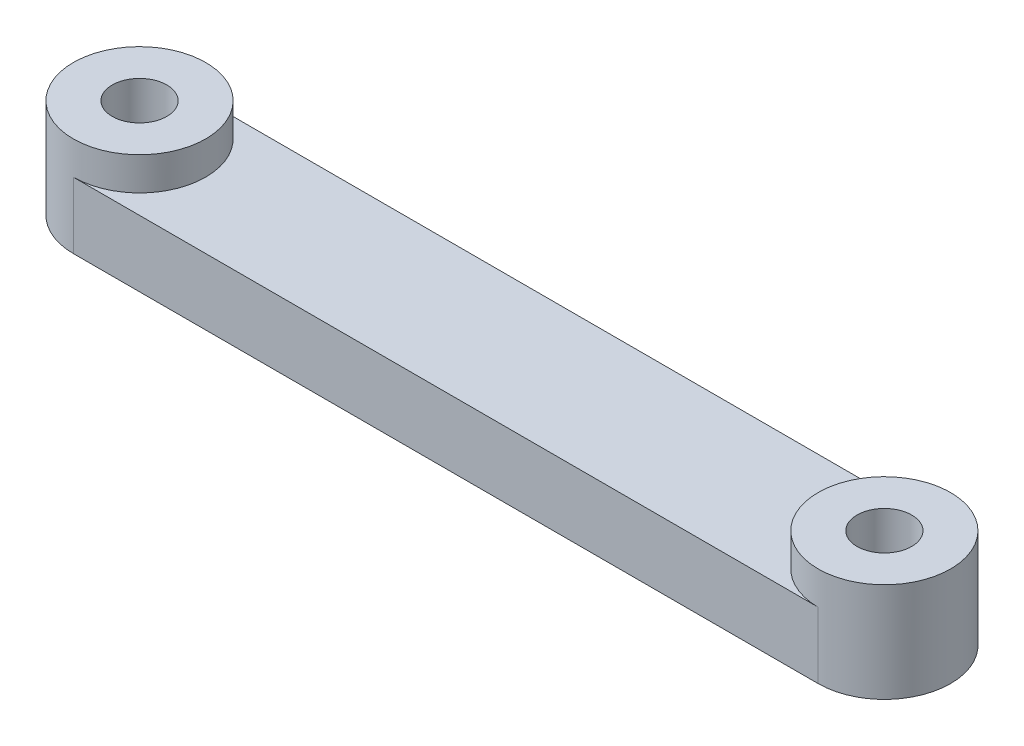
ISO-10303-21;
HEADER;
FILE_DESCRIPTION(('STEP AP214'),'2;1');
FILE_NAME('part.step','',(''),(''),'','','');
FILE_SCHEMA(('AUTOMOTIVE_DESIGN { 1 0 10303 214 1 1 1 1 }'));
ENDSEC;
DATA;
#1=APPLICATION_CONTEXT('core data for automotive mechanical design processes');
#2=APPLICATION_PROTOCOL_DEFINITION('international standard','automotive_design',2000,#1);
#3=PRODUCT_CONTEXT('',#1,'mechanical');
#4=PRODUCT('Part','Part','',(#3));
#5=PRODUCT_RELATED_PRODUCT_CATEGORY('part','',(#4));
#6=PRODUCT_DEFINITION_FORMATION('','',#4);
#7=PRODUCT_DEFINITION_CONTEXT('part definition',#1,'design');
#8=PRODUCT_DEFINITION('design','',#6,#7);
#9=PRODUCT_DEFINITION_SHAPE('','',#8);
#10=(LENGTH_UNIT() NAMED_UNIT(*) SI_UNIT(.MILLI.,.METRE.));
#11=(NAMED_UNIT(*) PLANE_ANGLE_UNIT() SI_UNIT($,.RADIAN.));
#12=(NAMED_UNIT(*) SI_UNIT($,.STERADIAN.) SOLID_ANGLE_UNIT());
#13=UNCERTAINTY_MEASURE_WITH_UNIT(LENGTH_MEASURE(1.E-05),#10,'distance_accuracy_value','');
#14=(GEOMETRIC_REPRESENTATION_CONTEXT(3) GLOBAL_UNCERTAINTY_ASSIGNED_CONTEXT((#13)) GLOBAL_UNIT_ASSIGNED_CONTEXT((#10,
#11,#12)) REPRESENTATION_CONTEXT('',''));
#15=CARTESIAN_POINT('',(0.,0.,0.));
#16=DIRECTION('',(0.,0.,1.));
#17=DIRECTION('',(1.,0.,0.));
#18=AXIS2_PLACEMENT_3D('',#15,#16,#17);
#19=CARTESIAN_POINT('',(-22.5,4.,0.));
#20=DIRECTION('',(0.,1.,0.));
#21=DIRECTION('',(0.,0.,1.));
#22=AXIS2_PLACEMENT_3D('',#19,#20,#21);
#23=PLANE('',#22);
#24=DIRECTION('',(1.,0.,0.));
#25=VECTOR('',#24,1.);
#26=CARTESIAN_POINT('',(-22.5,4.,4.));
#27=LINE('',#26,#25);
#28=CARTESIAN_POINT('',(-22.5,4.,4.));
#29=VERTEX_POINT('',#28);
#30=CARTESIAN_POINT('',(22.5,4.,4.));
#31=VERTEX_POINT('',#30);
#32=EDGE_CURVE('E95',#29,#31,#27,.T.);
#33=ORIENTED_EDGE('',*,*,#32,.T.);
#34=CARTESIAN_POINT('',(22.5,4.,0.));
#35=DIRECTION('',(0.,1.,0.));
#36=DIRECTION('',(0.,0.,1.));
#37=AXIS2_PLACEMENT_3D('',#34,#35,#36);
#38=CIRCLE('',#37,4.);
#39=CARTESIAN_POINT('',(22.5,4.,-4.));
#40=VERTEX_POINT('',#39);
#41=EDGE_CURVE('E128',#40,#31,#38,.T.);
#42=ORIENTED_EDGE('',*,*,#41,.F.);
#43=DIRECTION('',(-1.,0.,0.));
#44=VECTOR('',#43,1.);
#45=CARTESIAN_POINT('',(-22.5,4.,-4.));
#46=LINE('',#45,#44);
#47=CARTESIAN_POINT('',(-22.5,4.,-4.));
#48=VERTEX_POINT('',#47);
#49=EDGE_CURVE('E63',#40,#48,#46,.T.);
#50=ORIENTED_EDGE('',*,*,#49,.T.);
#51=CARTESIAN_POINT('',(-22.5,4.,0.));
#52=DIRECTION('',(0.,1.,0.));
#53=DIRECTION('',(0.,0.,1.));
#54=AXIS2_PLACEMENT_3D('',#51,#52,#53);
#55=CIRCLE('',#54,4.);
#56=EDGE_CURVE('E102',#29,#48,#55,.T.);
#57=ORIENTED_EDGE('',*,*,#56,.F.);
#58=EDGE_LOOP('',(#33,#42,#50,#57));
#59=FACE_BOUND('',#58,.T.);
#60=ADVANCED_FACE('F45',(#59),#23,.T.);
#61=CARTESIAN_POINT('',(-22.5,0.,0.));
#62=DIRECTION('',(0.,1.,0.));
#63=DIRECTION('',(0.,0.,1.));
#64=AXIS2_PLACEMENT_3D('',#61,#62,#63);
#65=PLANE('',#64);
#66=CARTESIAN_POINT('',(-22.5,0.,0.));
#67=DIRECTION('',(0.,1.,0.));
#68=DIRECTION('',(0.,0.,1.));
#69=AXIS2_PLACEMENT_3D('',#66,#67,#68);
#70=CIRCLE('',#69,4.);
#71=CARTESIAN_POINT('',(-22.5,0.,-4.));
#72=VERTEX_POINT('',#71);
#73=CARTESIAN_POINT('',(-22.5,0.,4.));
#74=VERTEX_POINT('',#73);
#75=EDGE_CURVE('E101',#72,#74,#70,.T.);
#76=ORIENTED_EDGE('',*,*,#75,.F.);
#77=DIRECTION('',(-1.,0.,0.));
#78=VECTOR('',#77,1.);
#79=CARTESIAN_POINT('',(-22.5,0.,-4.));
#80=LINE('',#79,#78);
#81=CARTESIAN_POINT('',(22.5,0.,-4.));
#82=VERTEX_POINT('',#81);
#83=EDGE_CURVE('E86',#82,#72,#80,.T.);
#84=ORIENTED_EDGE('',*,*,#83,.F.);
#85=CARTESIAN_POINT('',(22.5,0.,0.));
#86=DIRECTION('',(0.,1.,0.));
#87=DIRECTION('',(0.,0.,1.));
#88=AXIS2_PLACEMENT_3D('',#85,#86,#87);
#89=CIRCLE('',#88,4.);
#90=CARTESIAN_POINT('',(22.5,0.,4.));
#91=VERTEX_POINT('',#90);
#92=EDGE_CURVE('E81',#91,#82,#89,.T.);
#93=ORIENTED_EDGE('',*,*,#92,.F.);
#94=DIRECTION('',(1.,0.,0.));
#95=VECTOR('',#94,1.);
#96=CARTESIAN_POINT('',(-22.5,0.,4.));
#97=LINE('',#96,#95);
#98=EDGE_CURVE('E107',#74,#91,#97,.T.);
#99=ORIENTED_EDGE('',*,*,#98,.F.);
#100=EDGE_LOOP('',(#76,#84,#93,#99));
#101=FACE_BOUND('',#100,.T.);
#102=CARTESIAN_POINT('',(-22.5,0.,0.));
#103=DIRECTION('',(0.,1.,0.));
#104=DIRECTION('',(0.,0.,1.));
#105=AXIS2_PLACEMENT_3D('',#102,#103,#104);
#106=CIRCLE('',#105,1.65);
#107=CARTESIAN_POINT('',(-22.5,0.,1.65));
#108=VERTEX_POINT('',#107);
#109=EDGE_CURVE('E109',#108,#108,#106,.T.);
#110=ORIENTED_EDGE('',*,*,#109,.T.);
#111=EDGE_LOOP('',(#110));
#112=FACE_BOUND('',#111,.T.);
#113=CARTESIAN_POINT('',(22.5,0.,0.));
#114=DIRECTION('',(0.,1.,0.));
#115=DIRECTION('',(0.,0.,1.));
#116=AXIS2_PLACEMENT_3D('',#113,#114,#115);
#117=CIRCLE('',#116,1.65);
#118=CARTESIAN_POINT('',(22.5,0.,1.65));
#119=VERTEX_POINT('',#118);
#120=EDGE_CURVE('E115',#119,#119,#117,.T.);
#121=ORIENTED_EDGE('',*,*,#120,.T.);
#122=EDGE_LOOP('',(#121));
#123=FACE_BOUND('',#122,.T.);
#124=ADVANCED_FACE('F105',(#101,#112,#123),#65,.F.);
#125=CARTESIAN_POINT('',(-22.5,4.,0.));
#126=DIRECTION('',(0.,-1.,0.));
#127=DIRECTION('',(0.,0.,-1.));
#128=AXIS2_PLACEMENT_3D('',#125,#126,#127);
#129=CYLINDRICAL_SURFACE('',#128,4.);
#130=ORIENTED_EDGE('',*,*,#75,.T.);
#131=DIRECTION('',(0.,-1.,0.));
#132=VECTOR('',#131,1.);
#133=CARTESIAN_POINT('',(-22.5,4.,4.));
#134=LINE('',#133,#132);
#135=EDGE_CURVE('E11',#29,#74,#134,.T.);
#136=ORIENTED_EDGE('',*,*,#135,.F.);
#137=ORIENTED_EDGE('',*,*,#56,.T.);
#138=DIRECTION('',(0.,-1.,0.));
#139=VECTOR('',#138,1.);
#140=CARTESIAN_POINT('',(-22.5,4.,-4.));
#141=LINE('',#140,#139);
#142=EDGE_CURVE('E89',#48,#72,#141,.T.);
#143=ORIENTED_EDGE('',*,*,#142,.T.);
#144=EDGE_LOOP('',(#130,#136,#137,#143));
#145=FACE_BOUND('',#144,.T.);
#146=CARTESIAN_POINT('',(-22.5,6.,0.));
#147=DIRECTION('',(0.,1.,0.));
#148=DIRECTION('',(0.,0.,1.));
#149=AXIS2_PLACEMENT_3D('',#146,#147,#148);
#150=CIRCLE('',#149,4.);
#151=CARTESIAN_POINT('',(-22.5,6.,4.));
#152=VERTEX_POINT('',#151);
#153=EDGE_CURVE('E150',#152,#152,#150,.T.);
#154=ORIENTED_EDGE('',*,*,#153,.F.);
#155=EDGE_LOOP('',(#154));
#156=FACE_BOUND('',#155,.T.);
#157=ADVANCED_FACE('F47',(#145,#156),#129,.T.);
#158=CARTESIAN_POINT('',(-22.5,4.,4.));
#159=DIRECTION('',(0.,0.,-1.));
#160=DIRECTION('',(-1.,0.,0.));
#161=AXIS2_PLACEMENT_3D('',#158,#159,#160);
#162=PLANE('',#161);
#163=ORIENTED_EDGE('',*,*,#98,.T.);
#164=DIRECTION('',(0.,-1.,0.));
#165=VECTOR('',#164,1.);
#166=CARTESIAN_POINT('',(22.5,4.,4.));
#167=LINE('',#166,#165);
#168=EDGE_CURVE('E55',#31,#91,#167,.T.);
#169=ORIENTED_EDGE('',*,*,#168,.F.);
#170=ORIENTED_EDGE('',*,*,#32,.F.);
#171=ORIENTED_EDGE('',*,*,#135,.T.);
#172=EDGE_LOOP('',(#163,#169,#170,#171));
#173=FACE_BOUND('',#172,.T.);
#174=ADVANCED_FACE('F131',(#173),#162,.F.);
#175=CARTESIAN_POINT('',(22.5,4.,0.));
#176=DIRECTION('',(0.,-1.,0.));
#177=DIRECTION('',(0.,0.,-1.));
#178=AXIS2_PLACEMENT_3D('',#175,#176,#177);
#179=CYLINDRICAL_SURFACE('',#178,4.);
#180=ORIENTED_EDGE('',*,*,#92,.T.);
#181=DIRECTION('',(0.,-1.,0.));
#182=VECTOR('',#181,1.);
#183=CARTESIAN_POINT('',(22.5,4.,-4.));
#184=LINE('',#183,#182);
#185=EDGE_CURVE('E91',#40,#82,#184,.T.);
#186=ORIENTED_EDGE('',*,*,#185,.F.);
#187=ORIENTED_EDGE('',*,*,#41,.T.);
#188=ORIENTED_EDGE('',*,*,#168,.T.);
#189=EDGE_LOOP('',(#180,#186,#187,#188));
#190=FACE_BOUND('',#189,.T.);
#191=CARTESIAN_POINT('',(22.5,6.,0.));
#192=DIRECTION('',(0.,1.,0.));
#193=DIRECTION('',(0.,0.,1.));
#194=AXIS2_PLACEMENT_3D('',#191,#192,#193);
#195=CIRCLE('',#194,4.);
#196=CARTESIAN_POINT('',(22.5,6.,4.));
#197=VERTEX_POINT('',#196);
#198=EDGE_CURVE('E137',#197,#197,#195,.T.);
#199=ORIENTED_EDGE('',*,*,#198,.F.);
#200=EDGE_LOOP('',(#199));
#201=FACE_BOUND('',#200,.T.);
#202=ADVANCED_FACE('F126',(#190,#201),#179,.T.);
#203=CARTESIAN_POINT('',(-22.5,4.,-4.));
#204=DIRECTION('',(0.,0.,1.));
#205=DIRECTION('',(1.,0.,0.));
#206=AXIS2_PLACEMENT_3D('',#203,#204,#205);
#207=PLANE('',#206);
#208=ORIENTED_EDGE('',*,*,#83,.T.);
#209=ORIENTED_EDGE('',*,*,#142,.F.);
#210=ORIENTED_EDGE('',*,*,#49,.F.);
#211=ORIENTED_EDGE('',*,*,#185,.T.);
#212=EDGE_LOOP('',(#208,#209,#210,#211));
#213=FACE_BOUND('',#212,.T.);
#214=ADVANCED_FACE('F88',(#213),#207,.F.);
#215=CARTESIAN_POINT('',(-22.5,4.,0.));
#216=DIRECTION('',(0.,-1.,0.));
#217=DIRECTION('',(0.,0.,-1.));
#218=AXIS2_PLACEMENT_3D('',#215,#216,#217);
#219=CYLINDRICAL_SURFACE('',#218,1.65);
#220=ORIENTED_EDGE('',*,*,#109,.F.);
#221=EDGE_LOOP('',(#220));
#222=FACE_BOUND('',#221,.T.);
#223=CARTESIAN_POINT('',(-22.5,6.,0.));
#224=DIRECTION('',(0.,1.,0.));
#225=DIRECTION('',(0.,0.,1.));
#226=AXIS2_PLACEMENT_3D('',#223,#224,#225);
#227=CIRCLE('',#226,1.65);
#228=CARTESIAN_POINT('',(-22.5,6.,1.65));
#229=VERTEX_POINT('',#228);
#230=EDGE_CURVE('E142',#229,#229,#227,.T.);
#231=ORIENTED_EDGE('',*,*,#230,.T.);
#232=EDGE_LOOP('',(#231));
#233=FACE_BOUND('',#232,.T.);
#234=ADVANCED_FACE('F166',(#222,#233),#219,.F.);
#235=CARTESIAN_POINT('',(22.5,4.,0.));
#236=DIRECTION('',(0.,-1.,0.));
#237=DIRECTION('',(0.,0.,-1.));
#238=AXIS2_PLACEMENT_3D('',#235,#236,#237);
#239=CYLINDRICAL_SURFACE('',#238,1.65);
#240=ORIENTED_EDGE('',*,*,#120,.F.);
#241=EDGE_LOOP('',(#240));
#242=FACE_BOUND('',#241,.T.);
#243=CARTESIAN_POINT('',(22.5,6.,0.));
#244=DIRECTION('',(0.,1.,0.));
#245=DIRECTION('',(0.,0.,1.));
#246=AXIS2_PLACEMENT_3D('',#243,#244,#245);
#247=CIRCLE('',#246,1.65);
#248=CARTESIAN_POINT('',(22.5,6.,1.65));
#249=VERTEX_POINT('',#248);
#250=EDGE_CURVE('E136',#249,#249,#247,.T.);
#251=ORIENTED_EDGE('',*,*,#250,.T.);
#252=EDGE_LOOP('',(#251));
#253=FACE_BOUND('',#252,.T.);
#254=ADVANCED_FACE('F162',(#242,#253),#239,.F.);
#255=CARTESIAN_POINT('',(-22.5,6.,0.));
#256=DIRECTION('',(0.,1.,0.));
#257=DIRECTION('',(0.,0.,1.));
#258=AXIS2_PLACEMENT_3D('',#255,#256,#257);
#259=PLANE('',#258);
#260=ORIENTED_EDGE('',*,*,#153,.T.);
#261=EDGE_LOOP('',(#260));
#262=FACE_BOUND('',#261,.T.);
#263=ORIENTED_EDGE('',*,*,#230,.F.);
#264=EDGE_LOOP('',(#263));
#265=FACE_BOUND('',#264,.T.);
#266=ADVANCED_FACE('F165',(#262,#265),#259,.T.);
#267=CARTESIAN_POINT('',(22.5,6.,0.));
#268=DIRECTION('',(0.,1.,0.));
#269=DIRECTION('',(0.,0.,1.));
#270=AXIS2_PLACEMENT_3D('',#267,#268,#269);
#271=PLANE('',#270);
#272=ORIENTED_EDGE('',*,*,#198,.T.);
#273=EDGE_LOOP('',(#272));
#274=FACE_BOUND('',#273,.T.);
#275=ORIENTED_EDGE('',*,*,#250,.F.);
#276=EDGE_LOOP('',(#275));
#277=FACE_BOUND('',#276,.T.);
#278=ADVANCED_FACE('F170',(#274,#277),#271,.T.);
#279=CLOSED_SHELL('',(#60,#124,#157,#174,#202,#214,#234,#254,#266,#278));
#280=MANIFOLD_SOLID_BREP('B2',#279);
#281=ADVANCED_BREP_SHAPE_REPRESENTATION('',(#18,#280),#14);
#282=SHAPE_DEFINITION_REPRESENTATION(#9,#281);
ENDSEC;
END-ISO-10303-21;
